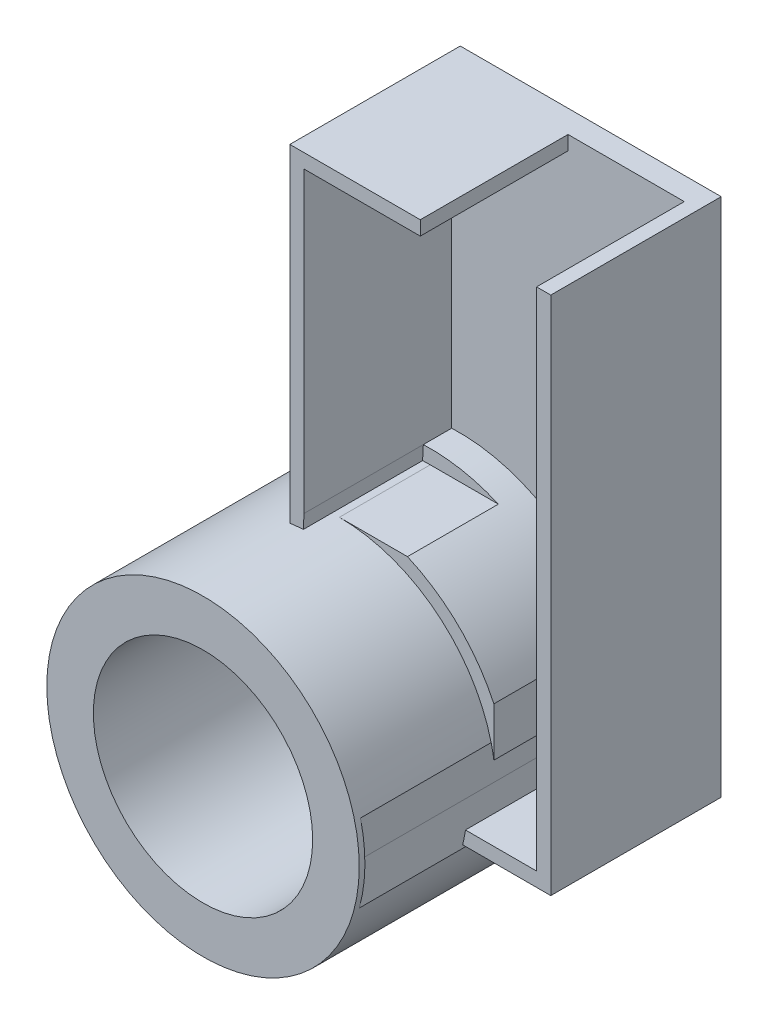
ISO-10303-21;
HEADER;
FILE_DESCRIPTION(('STEP AP214'),'2;1');
FILE_NAME('part.step','',(''),(''),'','','');
FILE_SCHEMA(('AUTOMOTIVE_DESIGN { 1 0 10303 214 1 1 1 1 }'));
ENDSEC;
DATA;
#1=APPLICATION_CONTEXT('core data for automotive mechanical design processes');
#2=APPLICATION_PROTOCOL_DEFINITION('international standard','automotive_design',2000,#1);
#3=PRODUCT_CONTEXT('',#1,'mechanical');
#4=PRODUCT('Part','Part','',(#3));
#5=PRODUCT_RELATED_PRODUCT_CATEGORY('part','',(#4));
#6=PRODUCT_DEFINITION_FORMATION('','',#4);
#7=PRODUCT_DEFINITION_CONTEXT('part definition',#1,'design');
#8=PRODUCT_DEFINITION('design','',#6,#7);
#9=PRODUCT_DEFINITION_SHAPE('','',#8);
#10=(LENGTH_UNIT() NAMED_UNIT(*) SI_UNIT(.MILLI.,.METRE.));
#11=(NAMED_UNIT(*) PLANE_ANGLE_UNIT() SI_UNIT($,.RADIAN.));
#12=(NAMED_UNIT(*) SI_UNIT($,.STERADIAN.) SOLID_ANGLE_UNIT());
#13=UNCERTAINTY_MEASURE_WITH_UNIT(LENGTH_MEASURE(1.E-05),#10,'distance_accuracy_value','');
#14=(GEOMETRIC_REPRESENTATION_CONTEXT(3) GLOBAL_UNCERTAINTY_ASSIGNED_CONTEXT((#13)) GLOBAL_UNIT_ASSIGNED_CONTEXT((#10,
#11,#12)) REPRESENTATION_CONTEXT('',''));
#15=CARTESIAN_POINT('',(0.,0.,0.));
#16=DIRECTION('',(0.,0.,1.));
#17=DIRECTION('',(1.,0.,0.));
#18=AXIS2_PLACEMENT_3D('',#15,#16,#17);
#19=CARTESIAN_POINT('',(28.235445078776,-0.900390084330371,92.));
#20=DIRECTION('',(0.999491944603137,-0.0318724437945979,0.));
#21=DIRECTION('',(0.0318724437945979,0.999491944603137,0.));
#22=AXIS2_PLACEMENT_3D('',#19,#20,#21);
#23=PLANE('',#22);
#24=DIRECTION('',(0.,0.,-1.));
#25=VECTOR('',#24,1.);
#26=CARTESIAN_POINT('',(26.7179309405717,-48.4883054237133,92.));
#27=LINE('',#26,#25);
#28=CARTESIAN_POINT('',(26.7179309405717,-48.4883054237133,69.));
#29=VERTEX_POINT('',#28);
#30=CARTESIAN_POINT('',(26.7179309405717,-48.4883054237133,47.));
#31=VERTEX_POINT('',#30);
#32=EDGE_CURVE('E277',#29,#31,#27,.T.);
#33=ORIENTED_EDGE('',*,*,#32,.F.);
#34=CARTESIAN_POINT('',(26.7179309405717,-48.4883054237133,92.));
#35=VERTEX_POINT('',#34);
#36=EDGE_CURVE('E271',#35,#29,#27,.T.);
#37=ORIENTED_EDGE('',*,*,#36,.F.);
#38=DIRECTION('',(0.0318724437945979,0.999491944603137,0.));
#39=VECTOR('',#38,1.);
#40=CARTESIAN_POINT('',(28.235445078776,-0.900390084330371,92.));
#41=LINE('',#40,#39);
#42=CARTESIAN_POINT('',(26.5102818239271,-55.,92.));
#43=VERTEX_POINT('',#42);
#44=EDGE_CURVE('E396',#43,#35,#41,.T.);
#45=ORIENTED_EDGE('',*,*,#44,.F.);
#46=DIRECTION('',(0.,0.,-1.));
#47=VECTOR('',#46,1.);
#48=CARTESIAN_POINT('',(26.5102818239271,-55.,92.));
#49=LINE('',#48,#47);
#50=CARTESIAN_POINT('',(26.5102818239271,-55.,47.));
#51=VERTEX_POINT('',#50);
#52=EDGE_CURVE('E280',#43,#51,#49,.T.);
#53=ORIENTED_EDGE('',*,*,#52,.T.);
#54=DIRECTION('',(-0.0318724437945979,-0.999491944603137,0.));
#55=VECTOR('',#54,1.);
#56=CARTESIAN_POINT('',(28.235445078776,-0.900390084330371,47.));
#57=LINE('',#56,#55);
#58=EDGE_CURVE('E412',#31,#51,#57,.T.);
#59=ORIENTED_EDGE('',*,*,#58,.F.);
#60=EDGE_LOOP('',(#33,#37,#45,#53,#59));
#61=FACE_BOUND('',#60,.T.);
#62=ADVANCED_FACE('F77',(#61),#23,.T.);
#63=CARTESIAN_POINT('',(26.5102818239271,0.,92.));
#64=DIRECTION('',(-1.,0.,0.));
#65=DIRECTION('',(0.,0.,-1.));
#66=AXIS2_PLACEMENT_3D('',#63,#64,#65);
#67=PLANE('',#66);
#68=DIRECTION('',(0.,1.,0.));
#69=VECTOR('',#68,1.);
#70=CARTESIAN_POINT('',(26.5102818239271,0.,47.));
#71=LINE('',#70,#69);
#72=CARTESIAN_POINT('',(26.5102818239271,-62.3112897368359,47.));
#73=VERTEX_POINT('',#72);
#74=EDGE_CURVE('E92',#73,#51,#71,.T.);
#75=ORIENTED_EDGE('',*,*,#74,.T.);
#76=ORIENTED_EDGE('',*,*,#52,.F.);
#77=DIRECTION('',(0.,-1.,0.));
#78=VECTOR('',#77,1.);
#79=CARTESIAN_POINT('',(26.5102818239271,0.,92.));
#80=LINE('',#79,#78);
#81=CARTESIAN_POINT('',(26.5102818239271,-62.3112897368359,92.));
#82=VERTEX_POINT('',#81);
#83=EDGE_CURVE('E401',#43,#82,#80,.T.);
#84=ORIENTED_EDGE('',*,*,#83,.T.);
#85=DIRECTION('',(0.,0.,-1.));
#86=VECTOR('',#85,1.);
#87=CARTESIAN_POINT('',(26.5102818239271,-62.3112897368359,92.));
#88=LINE('',#87,#86);
#89=EDGE_CURVE('E405',#82,#73,#88,.T.);
#90=ORIENTED_EDGE('',*,*,#89,.T.);
#91=EDGE_LOOP('',(#75,#76,#84,#90));
#92=FACE_BOUND('',#91,.T.);
#93=ADVANCED_FACE('F414',(#92),#67,.F.);
#94=CARTESIAN_POINT('',(0.,-81.9229318060306,92.));
#95=DIRECTION('',(0.,-1.,0.));
#96=DIRECTION('',(0.,0.,1.));
#97=AXIS2_PLACEMENT_3D('',#94,#95,#96);
#98=PLANE('',#97);
#99=DIRECTION('',(0.,0.,-1.));
#100=VECTOR('',#99,1.);
#101=CARTESIAN_POINT('',(5.60408270529834,-81.9229318060306,92.));
#102=LINE('',#101,#100);
#103=CARTESIAN_POINT('',(5.60408270529834,-81.9229318060306,92.));
#104=VERTEX_POINT('',#103);
#105=CARTESIAN_POINT('',(5.60408270529834,-81.9229318060306,47.));
#106=VERTEX_POINT('',#105);
#107=EDGE_CURVE('E393',#104,#106,#102,.T.);
#108=ORIENTED_EDGE('',*,*,#107,.F.);
#109=DIRECTION('',(1.,0.,0.));
#110=VECTOR('',#109,1.);
#111=CARTESIAN_POINT('',(0.,-81.9229318060306,92.));
#112=LINE('',#111,#110);
#113=CARTESIAN_POINT('',(-5.60408270529832,-81.9229318060306,92.));
#114=VERTEX_POINT('',#113);
#115=EDGE_CURVE('E381',#114,#104,#112,.T.);
#116=ORIENTED_EDGE('',*,*,#115,.F.);
#117=DIRECTION('',(0.,0.,-1.));
#118=VECTOR('',#117,1.);
#119=CARTESIAN_POINT('',(-5.60408270529832,-81.9229318060306,92.));
#120=LINE('',#119,#118);
#121=CARTESIAN_POINT('',(-5.60408270529832,-81.9229318060306,47.));
#122=VERTEX_POINT('',#121);
#123=EDGE_CURVE('E392',#114,#122,#120,.T.);
#124=ORIENTED_EDGE('',*,*,#123,.T.);
#125=DIRECTION('',(-1.,0.,0.));
#126=VECTOR('',#125,1.);
#127=CARTESIAN_POINT('',(0.,-81.9229318060306,47.));
#128=LINE('',#127,#126);
#129=EDGE_CURVE('E505',#106,#122,#128,.T.);
#130=ORIENTED_EDGE('',*,*,#129,.F.);
#131=EDGE_LOOP('',(#108,#116,#124,#130));
#132=FACE_BOUND('',#131,.T.);
#133=ADVANCED_FACE('F550',(#132),#98,.T.);
#134=CARTESIAN_POINT('',(0.,-55.,48.));
#135=DIRECTION('',(0.,0.,-1.));
#136=DIRECTION('',(1.,0.,0.));
#137=AXIS2_PLACEMENT_3D('',#134,#135,#136);
#138=CYLINDRICAL_SURFACE('',#137,27.5);
#139=CARTESIAN_POINT('',(0.,-55.,47.));
#140=DIRECTION('',(0.,0.,1.));
#141=DIRECTION('',(1.,0.,0.));
#142=AXIS2_PLACEMENT_3D('',#139,#140,#141);
#143=CIRCLE('',#142,27.5);
#144=CARTESIAN_POINT('',(26.7042036884893,-61.5677625842956,47.));
#145=VERTEX_POINT('',#144);
#146=EDGE_CURVE('E419',#145,#31,#143,.T.);
#147=ORIENTED_EDGE('',*,*,#146,.F.);
#148=DIRECTION('',(0.,0.,-1.));
#149=VECTOR('',#148,1.);
#150=CARTESIAN_POINT('',(26.7042036884893,-61.5677625842956,48.));
#151=LINE('',#150,#149);
#152=CARTESIAN_POINT('',(26.7042036884893,-61.5677625842956,74.));
#153=VERTEX_POINT('',#152);
#154=EDGE_CURVE('E261',#153,#145,#151,.T.);
#155=ORIENTED_EDGE('',*,*,#154,.F.);
#156=CARTESIAN_POINT('',(9.26342336171615E-13,-54.9999999999992,74.));
#157=DIRECTION('',(0.,0.,1.));
#158=DIRECTION('',(-1.,0.,0.));
#159=AXIS2_PLACEMENT_3D('',#156,#157,#158);
#160=CIRCLE('',#159,27.4999999999993);
#161=CARTESIAN_POINT('',(27.19748715521,-59.0677625842956,74.));
#162=VERTEX_POINT('',#161);
#163=EDGE_CURVE('E362',#153,#162,#160,.T.);
#164=ORIENTED_EDGE('',*,*,#163,.T.);
#165=DIRECTION('',(0.,0.,1.));
#166=VECTOR('',#165,1.);
#167=CARTESIAN_POINT('',(27.19748715521,-59.0677625842956,53.));
#168=LINE('',#167,#166);
#169=CARTESIAN_POINT('',(27.19748715521,-59.0677625842956,53.));
#170=VERTEX_POINT('',#169);
#171=EDGE_CURVE('E320',#170,#162,#168,.T.);
#172=ORIENTED_EDGE('',*,*,#171,.F.);
#173=CARTESIAN_POINT('',(0.,-55.,53.));
#174=DIRECTION('',(0.,0.,1.));
#175=DIRECTION('',(1.,0.,0.));
#176=AXIS2_PLACEMENT_3D('',#173,#174,#175);
#177=CIRCLE('',#176,27.5000000000001);
#178=CARTESIAN_POINT('',(27.19748715521,-50.9322374157041,53.));
#179=VERTEX_POINT('',#178);
#180=EDGE_CURVE('E301',#170,#179,#177,.T.);
#181=ORIENTED_EDGE('',*,*,#180,.T.);
#182=DIRECTION('',(0.,0.,-1.));
#183=VECTOR('',#182,1.);
#184=CARTESIAN_POINT('',(27.19748715521,-50.9322374157041,69.));
#185=LINE('',#184,#183);
#186=CARTESIAN_POINT('',(27.19748715521,-50.9322374157041,69.));
#187=VERTEX_POINT('',#186);
#188=EDGE_CURVE('E309',#187,#179,#185,.T.);
#189=ORIENTED_EDGE('',*,*,#188,.F.);
#190=CARTESIAN_POINT('',(1.02890786168874E-13,-55.,69.));
#191=DIRECTION('',(0.,0.,-1.));
#192=DIRECTION('',(-1.,0.,0.));
#193=AXIS2_PLACEMENT_3D('',#190,#191,#192);
#194=CIRCLE('',#193,27.5);
#195=EDGE_CURVE('E420',#29,#187,#194,.T.);
#196=ORIENTED_EDGE('',*,*,#195,.F.);
#197=ORIENTED_EDGE('',*,*,#32,.T.);
#198=EDGE_LOOP('',(#147,#155,#164,#172,#181,#189,#196,#197));
#199=FACE_BOUND('',#198,.T.);
#200=ADVANCED_FACE('F317',(#199),#138,.F.);
#201=CARTESIAN_POINT('',(9.26342336171615E-13,-54.9999999999992,74.));
#202=DIRECTION('',(0.,0.,-1.));
#203=DIRECTION('',(1.,0.,0.));
#204=AXIS2_PLACEMENT_3D('',#201,#202,#203);
#205=PLANE('',#204);
#206=DIRECTION('',(0.,-1.,0.));
#207=VECTOR('',#206,1.);
#208=CARTESIAN_POINT('',(39.7172468413498,29.9886968621763,74.));
#209=LINE('',#208,#207);
#210=CARTESIAN_POINT('',(39.7172468413498,29.9886968621763,74.));
#211=VERTEX_POINT('',#210);
#212=CARTESIAN_POINT('',(39.7172468413498,-59.0677625842956,74.));
#213=VERTEX_POINT('',#212);
#214=EDGE_CURVE('E344',#211,#213,#209,.T.);
#215=ORIENTED_EDGE('',*,*,#214,.T.);
#216=DIRECTION('',(-1.,0.,0.));
#217=VECTOR('',#216,1.);
#218=CARTESIAN_POINT('',(26.7042036884893,-59.0677625842956,74.));
#219=LINE('',#218,#217);
#220=EDGE_CURVE('E347',#213,#162,#219,.T.);
#221=ORIENTED_EDGE('',*,*,#220,.T.);
#222=ORIENTED_EDGE('',*,*,#163,.F.);
#223=DIRECTION('',(-1.,0.,0.));
#224=VECTOR('',#223,1.);
#225=CARTESIAN_POINT('',(26.7042036884893,-61.5677625842956,74.));
#226=LINE('',#225,#224);
#227=CARTESIAN_POINT('',(42.2172468413498,-61.5677625842956,74.));
#228=VERTEX_POINT('',#227);
#229=EDGE_CURVE('E255',#228,#153,#226,.T.);
#230=ORIENTED_EDGE('',*,*,#229,.F.);
#231=DIRECTION('',(0.,-1.,0.));
#232=VECTOR('',#231,1.);
#233=CARTESIAN_POINT('',(42.2172468413498,29.9886968621763,74.));
#234=LINE('',#233,#232);
#235=CARTESIAN_POINT('',(42.2172468413498,29.9886968621763,74.));
#236=VERTEX_POINT('',#235);
#237=EDGE_CURVE('E371',#236,#228,#234,.T.);
#238=ORIENTED_EDGE('',*,*,#237,.F.);
#239=DIRECTION('',(1.,0.,0.));
#240=VECTOR('',#239,1.);
#241=CARTESIAN_POINT('',(42.2172468413498,29.9886968621763,74.));
#242=LINE('',#241,#240);
#243=EDGE_CURVE('E367',#211,#236,#242,.T.);
#244=ORIENTED_EDGE('',*,*,#243,.F.);
#245=EDGE_LOOP('',(#215,#221,#222,#230,#238,#244));
#246=FACE_BOUND('',#245,.T.);
#247=ADVANCED_FACE('F478',(#246),#205,.F.);
#248=CARTESIAN_POINT('',(0.,-55.,53.));
#249=DIRECTION('',(0.,0.,1.));
#250=DIRECTION('',(-1.,0.,0.));
#251=AXIS2_PLACEMENT_3D('',#248,#249,#250);
#252=PLANE('',#251);
#253=CARTESIAN_POINT('',(0.,-55.,53.));
#254=DIRECTION('',(0.,0.,-1.));
#255=DIRECTION('',(-1.,0.,0.));
#256=AXIS2_PLACEMENT_3D('',#253,#254,#255);
#257=CIRCLE('',#256,30.0000000000001);
#258=CARTESIAN_POINT('',(-1.21934232207703,-25.0247901708496,53.));
#259=VERTEX_POINT('',#258);
#260=CARTESIAN_POINT('',(11.9895788082825,-27.5000000000002,53.));
#261=VERTEX_POINT('',#260);
#262=EDGE_CURVE('E439',#259,#261,#257,.T.);
#263=ORIENTED_EDGE('',*,*,#262,.F.);
#264=DIRECTION('',(0.0515044310788241,0.998672766014597,0.));
#265=VECTOR('',#264,1.);
#266=CARTESIAN_POINT('',(-1.34870270419509,-27.5330926201055,53.));
#267=LINE('',#266,#265);
#268=CARTESIAN_POINT('',(-1.34870270419509,-27.5330926201055,53.));
#269=VERTEX_POINT('',#268);
#270=EDGE_CURVE('E321',#269,#259,#267,.T.);
#271=ORIENTED_EDGE('',*,*,#270,.F.);
#272=CARTESIAN_POINT('',(0.,-27.4999999999999,53.));
#273=VERTEX_POINT('',#272);
#274=EDGE_CURVE('E322',#273,#269,#177,.T.);
#275=ORIENTED_EDGE('',*,*,#274,.F.);
#276=DIRECTION('',(-1.,0.,0.));
#277=VECTOR('',#276,1.);
#278=CARTESIAN_POINT('',(0.,-27.4999999999999,53.));
#279=LINE('',#278,#277);
#280=EDGE_CURVE('E12',#261,#273,#279,.T.);
#281=ORIENTED_EDGE('',*,*,#280,.F.);
#282=EDGE_LOOP('',(#263,#271,#275,#281));
#283=FACE_BOUND('',#282,.T.);
#284=ADVANCED_FACE('F456',(#283),#252,.T.);
#285=CARTESIAN_POINT('',(9.26342336171615E-13,-54.9999999999992,74.));
#286=DIRECTION('',(0.,0.,-1.));
#287=DIRECTION('',(1.,0.,0.));
#288=AXIS2_PLACEMENT_3D('',#285,#286,#287);
#289=CYLINDRICAL_SURFACE('',#288,29.9999999999993);
#290=CARTESIAN_POINT('',(27.19748715521,-42.3391669925634,53.));
#291=VERTEX_POINT('',#290);
#292=CARTESIAN_POINT('',(29.722942444479,-59.0677625842956,53.));
#293=VERTEX_POINT('',#292);
#294=EDGE_CURVE('E304',#291,#293,#257,.T.);
#295=ORIENTED_EDGE('',*,*,#294,.T.);
#296=DIRECTION('',(0.,0.,-1.));
#297=VECTOR('',#296,1.);
#298=CARTESIAN_POINT('',(29.722942444479,-59.0677625842956,74.));
#299=LINE('',#298,#297);
#300=CARTESIAN_POINT('',(29.722942444479,-59.0677625842956,48.));
#301=VERTEX_POINT('',#300);
#302=EDGE_CURVE('E349',#293,#301,#299,.T.);
#303=ORIENTED_EDGE('',*,*,#302,.T.);
#304=CARTESIAN_POINT('',(9.26342336171615E-13,-54.9999999999992,48.));
#305=DIRECTION('',(0.,0.,1.));
#306=DIRECTION('',(1.,0.,0.));
#307=AXIS2_PLACEMENT_3D('',#304,#305,#306);
#308=CIRCLE('',#307,29.9999999999993);
#309=CARTESIAN_POINT('',(-1.21934232207703,-25.0247901708496,48.));
#310=VERTEX_POINT('',#309);
#311=EDGE_CURVE('E293',#301,#310,#308,.T.);
#312=ORIENTED_EDGE('',*,*,#311,.T.);
#313=DIRECTION('',(0.,0.,-1.));
#314=VECTOR('',#313,1.);
#315=CARTESIAN_POINT('',(-1.21934232207703,-25.0247901708496,74.));
#316=LINE('',#315,#314);
#317=EDGE_CURVE('E358',#259,#310,#316,.T.);
#318=ORIENTED_EDGE('',*,*,#317,.F.);
#319=ORIENTED_EDGE('',*,*,#262,.T.);
#320=DIRECTION('',(0.,0.,-1.));
#321=VECTOR('',#320,1.);
#322=CARTESIAN_POINT('',(11.9895788082827,-27.4999999999999,69.));
#323=LINE('',#322,#321);
#324=CARTESIAN_POINT('',(11.9895788082827,-27.4999999999999,69.));
#325=VERTEX_POINT('',#324);
#326=EDGE_CURVE('E437',#325,#261,#323,.T.);
#327=ORIENTED_EDGE('',*,*,#326,.F.);
#328=CARTESIAN_POINT('',(9.26342336171615E-13,-54.9999999999992,69.));
#329=DIRECTION('',(0.,0.,-1.));
#330=DIRECTION('',(-1.,0.,0.));
#331=AXIS2_PLACEMENT_3D('',#328,#329,#330);
#332=CIRCLE('',#331,29.9999999999993);
#333=CARTESIAN_POINT('',(27.19748715521,-42.3391669925625,69.));
#334=VERTEX_POINT('',#333);
#335=EDGE_CURVE('E432',#334,#325,#332,.F.);
#336=ORIENTED_EDGE('',*,*,#335,.F.);
#337=DIRECTION('',(0.,0.,-1.));
#338=VECTOR('',#337,1.);
#339=CARTESIAN_POINT('',(27.19748715521,-42.3391669925625,69.));
#340=LINE('',#339,#338);
#341=EDGE_CURVE('E315',#334,#291,#340,.T.);
#342=ORIENTED_EDGE('',*,*,#341,.T.);
#343=EDGE_LOOP('',(#295,#303,#312,#318,#319,#327,#336,#342));
#344=FACE_BOUND('',#343,.T.);
#345=ADVANCED_FACE('F445',(#344),#289,.T.);
#346=CARTESIAN_POINT('',(0.,-55.,44.));
#347=DIRECTION('',(0.,0.,1.));
#348=DIRECTION('',(-1.,0.,0.));
#349=AXIS2_PLACEMENT_3D('',#346,#347,#348);
#350=CYLINDRICAL_SURFACE('',#349,27.5);
#351=ORIENTED_EDGE('',*,*,#123,.F.);
#352=CARTESIAN_POINT('',(0.,-55.,92.));
#353=DIRECTION('',(0.,0.,1.));
#354=DIRECTION('',(1.,0.,0.));
#355=AXIS2_PLACEMENT_3D('',#352,#353,#354);
#356=CIRCLE('',#355,27.5);
#357=EDGE_CURVE('E390',#114,#104,#356,.T.);
#358=ORIENTED_EDGE('',*,*,#357,.T.);
#359=ORIENTED_EDGE('',*,*,#107,.T.);
#360=EDGE_CURVE('E508',#122,#106,#143,.T.);
#361=ORIENTED_EDGE('',*,*,#360,.F.);
#362=EDGE_LOOP('',(#351,#358,#359,#361));
#363=FACE_BOUND('',#362,.T.);
#364=CARTESIAN_POINT('',(0.,-55.,44.));
#365=DIRECTION('',(0.,0.,1.));
#366=DIRECTION('',(1.,0.,0.));
#367=AXIS2_PLACEMENT_3D('',#364,#365,#366);
#368=CIRCLE('',#367,27.5);
#369=CARTESIAN_POINT('',(-3.71934232207703,-27.7526791648939,44.));
#370=VERTEX_POINT('',#369);
#371=CARTESIAN_POINT('',(26.7042036884893,-61.5677625842956,44.));
#372=VERTEX_POINT('',#371);
#373=EDGE_CURVE('E250',#370,#372,#368,.T.);
#374=ORIENTED_EDGE('',*,*,#373,.T.);
#375=EDGE_CURVE('E258',#145,#372,#151,.T.);
#376=ORIENTED_EDGE('',*,*,#375,.F.);
#377=EDGE_CURVE('E100',#73,#145,#143,.T.);
#378=ORIENTED_EDGE('',*,*,#377,.F.);
#379=ORIENTED_EDGE('',*,*,#89,.F.);
#380=CARTESIAN_POINT('',(0.,-55.,92.));
#381=DIRECTION('',(0.,0.,1.));
#382=DIRECTION('',(1.,0.,0.));
#383=AXIS2_PLACEMENT_3D('',#380,#381,#382);
#384=CIRCLE('',#383,27.5);
#385=EDGE_CURVE('E404',#82,#35,#384,.T.);
#386=ORIENTED_EDGE('',*,*,#385,.T.);
#387=ORIENTED_EDGE('',*,*,#36,.T.);
#388=CARTESIAN_POINT('',(1.02751297047818E-13,-27.5,69.));
#389=VERTEX_POINT('',#388);
#390=EDGE_CURVE('E418',#389,#29,#194,.T.);
#391=ORIENTED_EDGE('',*,*,#390,.F.);
#392=DIRECTION('',(0.,0.,-1.));
#393=VECTOR('',#392,1.);
#394=CARTESIAN_POINT('',(1.02751297047818E-13,-27.4999999999999,69.));
#395=LINE('',#394,#393);
#396=EDGE_CURVE('E333',#389,#273,#395,.T.);
#397=ORIENTED_EDGE('',*,*,#396,.T.);
#398=ORIENTED_EDGE('',*,*,#274,.T.);
#399=DIRECTION('',(0.,0.,1.));
#400=VECTOR('',#399,1.);
#401=CARTESIAN_POINT('',(-1.34870270419509,-27.5330926201055,53.));
#402=LINE('',#401,#400);
#403=CARTESIAN_POINT('',(-1.34870270419509,-27.5330926201055,74.));
#404=VERTEX_POINT('',#403);
#405=EDGE_CURVE('E334',#269,#404,#402,.T.);
#406=ORIENTED_EDGE('',*,*,#405,.T.);
#407=CARTESIAN_POINT('',(-3.71934232207703,-27.7526791648939,74.));
#408=VERTEX_POINT('',#407);
#409=EDGE_CURVE('E361',#404,#408,#160,.T.);
#410=ORIENTED_EDGE('',*,*,#409,.T.);
#411=DIRECTION('',(0.,0.,-1.));
#412=VECTOR('',#411,1.);
#413=CARTESIAN_POINT('',(-3.71934232207703,-27.7526791648939,48.));
#414=LINE('',#413,#412);
#415=EDGE_CURVE('E269',#408,#370,#414,.T.);
#416=ORIENTED_EDGE('',*,*,#415,.T.);
#417=EDGE_LOOP('',(#374,#376,#378,#379,#386,#387,#391,#397,#398,#406,#410,#416));
#418=FACE_BOUND('',#417,.T.);
#419=CARTESIAN_POINT('',(0.,-55.,93.));
#420=DIRECTION('',(0.,0.,-1.));
#421=DIRECTION('',(-1.,0.,0.));
#422=AXIS2_PLACEMENT_3D('',#419,#420,#421);
#423=CIRCLE('',#422,27.5);
#424=CARTESIAN_POINT('',(-27.5,-55.,93.));
#425=VERTEX_POINT('',#424);
#426=EDGE_CURVE('E270',#425,#425,#423,.T.);
#427=ORIENTED_EDGE('',*,*,#426,.T.);
#428=EDGE_LOOP('',(#427));
#429=FACE_BOUND('',#428,.T.);
#430=ADVANCED_FACE('F79',(#363,#418,#429),#350,.T.);
#431=CARTESIAN_POINT('',(0.,-55.,44.));
#432=DIRECTION('',(0.,0.,-1.));
#433=DIRECTION('',(1.,0.,0.));
#434=AXIS2_PLACEMENT_3D('',#431,#432,#433);
#435=PLANE('',#434);
#436=DIRECTION('',(0.,-1.,0.));
#437=VECTOR('',#436,1.);
#438=CARTESIAN_POINT('',(-3.71934232207703,0.,44.));
#439=LINE('',#438,#437);
#440=CARTESIAN_POINT('',(-3.71934232207703,29.9886968621763,44.));
#441=VERTEX_POINT('',#440);
#442=EDGE_CURVE('E263',#441,#370,#439,.T.);
#443=ORIENTED_EDGE('',*,*,#442,.F.);
#444=DIRECTION('',(-1.,0.,0.));
#445=VECTOR('',#444,1.);
#446=CARTESIAN_POINT('',(0.,29.9886968621763,44.));
#447=LINE('',#446,#445);
#448=CARTESIAN_POINT('',(42.2172468413498,29.9886968621763,44.));
#449=VERTEX_POINT('',#448);
#450=EDGE_CURVE('E376',#449,#441,#447,.T.);
#451=ORIENTED_EDGE('',*,*,#450,.F.);
#452=DIRECTION('',(0.,1.,0.));
#453=VECTOR('',#452,1.);
#454=CARTESIAN_POINT('',(42.2172468413498,0.,44.));
#455=LINE('',#454,#453);
#456=CARTESIAN_POINT('',(42.2172468413498,-61.5677625842956,44.));
#457=VERTEX_POINT('',#456);
#458=EDGE_CURVE('E253',#457,#449,#455,.T.);
#459=ORIENTED_EDGE('',*,*,#458,.F.);
#460=DIRECTION('',(1.,0.,0.));
#461=VECTOR('',#460,1.);
#462=CARTESIAN_POINT('',(0.,-61.5677625842956,44.));
#463=LINE('',#462,#461);
#464=EDGE_CURVE('E244',#372,#457,#463,.T.);
#465=ORIENTED_EDGE('',*,*,#464,.F.);
#466=ORIENTED_EDGE('',*,*,#373,.F.);
#467=EDGE_LOOP('',(#443,#451,#459,#465,#466));
#468=FACE_BOUND('',#467,.T.);
#469=CARTESIAN_POINT('',(0.,-55.,44.));
#470=DIRECTION('',(0.,0.,1.));
#471=DIRECTION('',(1.,0.,0.));
#472=AXIS2_PLACEMENT_3D('',#469,#470,#471);
#473=CIRCLE('',#472,7.25);
#474=CARTESIAN_POINT('',(7.25000000000001,-55.,44.));
#475=VERTEX_POINT('',#474);
#476=EDGE_CURVE('E511',#475,#475,#473,.T.);
#477=ORIENTED_EDGE('',*,*,#476,.T.);
#478=EDGE_LOOP('',(#477));
#479=FACE_BOUND('',#478,.T.);
#480=ADVANCED_FACE('F247',(#468,#479),#435,.T.);
#481=CARTESIAN_POINT('',(0.,-55.,93.));
#482=DIRECTION('',(0.,0.,1.));
#483=DIRECTION('',(-1.,0.,0.));
#484=AXIS2_PLACEMENT_3D('',#481,#482,#483);
#485=PLANE('',#484);
#486=CARTESIAN_POINT('',(0.,-55.,93.));
#487=DIRECTION('',(0.,0.,1.));
#488=DIRECTION('',(1.,0.,0.));
#489=AXIS2_PLACEMENT_3D('',#486,#487,#488);
#490=CIRCLE('',#489,19.3);
#491=CARTESIAN_POINT('',(19.3,-55.,93.));
#492=VERTEX_POINT('',#491);
#493=EDGE_CURVE('E517',#492,#492,#490,.T.);
#494=ORIENTED_EDGE('',*,*,#493,.F.);
#495=EDGE_LOOP('',(#494));
#496=FACE_BOUND('',#495,.T.);
#497=ORIENTED_EDGE('',*,*,#426,.F.);
#498=EDGE_LOOP('',(#497));
#499=FACE_BOUND('',#498,.T.);
#500=ADVANCED_FACE('F532',(#496,#499),#485,.T.);
#501=CARTESIAN_POINT('',(0.,0.,92.));
#502=DIRECTION('',(0.,0.,-1.));
#503=DIRECTION('',(1.,0.,0.));
#504=AXIS2_PLACEMENT_3D('',#501,#502,#503);
#505=PLANE('',#504);
#506=ORIENTED_EDGE('',*,*,#44,.T.);
#507=ORIENTED_EDGE('',*,*,#385,.F.);
#508=ORIENTED_EDGE('',*,*,#83,.F.);
#509=EDGE_LOOP('',(#506,#507,#508));
#510=FACE_BOUND('',#509,.T.);
#511=ADVANCED_FACE('F416',(#510),#505,.T.);
#512=CARTESIAN_POINT('',(0.,0.,92.));
#513=DIRECTION('',(0.,0.,-1.));
#514=DIRECTION('',(1.,0.,0.));
#515=AXIS2_PLACEMENT_3D('',#512,#513,#514);
#516=PLANE('',#515);
#517=ORIENTED_EDGE('',*,*,#115,.T.);
#518=ORIENTED_EDGE('',*,*,#357,.F.);
#519=EDGE_LOOP('',(#517,#518));
#520=FACE_BOUND('',#519,.T.);
#521=ADVANCED_FACE('F555',(#520),#516,.T.);
#522=CARTESIAN_POINT('',(-3.71934232207703,0.,48.));
#523=DIRECTION('',(-1.,0.,0.));
#524=DIRECTION('',(0.,0.,-1.));
#525=AXIS2_PLACEMENT_3D('',#522,#523,#524);
#526=PLANE('',#525);
#527=ORIENTED_EDGE('',*,*,#442,.T.);
#528=ORIENTED_EDGE('',*,*,#415,.F.);
#529=DIRECTION('',(0.,1.,0.));
#530=VECTOR('',#529,1.);
#531=CARTESIAN_POINT('',(-3.71934232207703,29.9886968621763,74.));
#532=LINE('',#531,#530);
#533=CARTESIAN_POINT('',(-3.71934232207703,29.9886968621763,74.));
#534=VERTEX_POINT('',#533);
#535=EDGE_CURVE('E364',#408,#534,#532,.T.);
#536=ORIENTED_EDGE('',*,*,#535,.T.);
#537=DIRECTION('',(0.,0.,-1.));
#538=VECTOR('',#537,1.);
#539=CARTESIAN_POINT('',(-3.71934232207703,29.9886968621763,48.));
#540=LINE('',#539,#538);
#541=EDGE_CURVE('E382',#534,#441,#540,.T.);
#542=ORIENTED_EDGE('',*,*,#541,.T.);
#543=EDGE_LOOP('',(#527,#528,#536,#542));
#544=FACE_BOUND('',#543,.T.);
#545=ADVANCED_FACE('F466',(#544),#526,.T.);
#546=CARTESIAN_POINT('',(0.,29.9886968621763,48.));
#547=DIRECTION('',(0.,1.,0.));
#548=DIRECTION('',(0.,0.,-1.));
#549=AXIS2_PLACEMENT_3D('',#546,#547,#548);
#550=PLANE('',#549);
#551=DIRECTION('',(1.,0.,0.));
#552=VECTOR('',#551,1.);
#553=CARTESIAN_POINT('',(19.2489522596364,29.9886968621763,48.));
#554=LINE('',#553,#552);
#555=CARTESIAN_POINT('',(19.2489522596364,29.9886968621763,48.));
#556=VERTEX_POINT('',#555);
#557=CARTESIAN_POINT('',(39.7172468413498,29.9886968621763,48.));
#558=VERTEX_POINT('',#557);
#559=EDGE_CURVE('E497',#556,#558,#554,.T.);
#560=ORIENTED_EDGE('',*,*,#559,.T.);
#561=DIRECTION('',(0.,0.,1.));
#562=VECTOR('',#561,1.);
#563=CARTESIAN_POINT('',(39.7172468413498,29.9886968621763,53.));
#564=LINE('',#563,#562);
#565=EDGE_CURVE('E422',#558,#211,#564,.T.);
#566=ORIENTED_EDGE('',*,*,#565,.T.);
#567=ORIENTED_EDGE('',*,*,#243,.T.);
#568=DIRECTION('',(0.,0.,-1.));
#569=VECTOR('',#568,1.);
#570=CARTESIAN_POINT('',(42.2172468413498,29.9886968621763,48.));
#571=LINE('',#570,#569);
#572=EDGE_CURVE('E384',#236,#449,#571,.T.);
#573=ORIENTED_EDGE('',*,*,#572,.T.);
#574=ORIENTED_EDGE('',*,*,#450,.T.);
#575=ORIENTED_EDGE('',*,*,#541,.F.);
#576=CARTESIAN_POINT('',(19.2489522596364,29.9886968621763,74.));
#577=VERTEX_POINT('',#576);
#578=EDGE_CURVE('E368',#534,#577,#242,.T.);
#579=ORIENTED_EDGE('',*,*,#578,.T.);
#580=DIRECTION('',(0.,0.,1.));
#581=VECTOR('',#580,1.);
#582=CARTESIAN_POINT('',(19.2489522596364,29.9886968621763,53.));
#583=LINE('',#582,#581);
#584=EDGE_CURVE('E425',#556,#577,#583,.T.);
#585=ORIENTED_EDGE('',*,*,#584,.F.);
#586=EDGE_LOOP('',(#560,#566,#567,#573,#574,#575,#579,#585));
#587=FACE_BOUND('',#586,.T.);
#588=ADVANCED_FACE('F469',(#587),#550,.T.);
#589=CARTESIAN_POINT('',(42.2172468413498,0.,48.));
#590=DIRECTION('',(1.,0.,0.));
#591=DIRECTION('',(0.,0.,1.));
#592=AXIS2_PLACEMENT_3D('',#589,#590,#591);
#593=PLANE('',#592);
#594=ORIENTED_EDGE('',*,*,#458,.T.);
#595=ORIENTED_EDGE('',*,*,#572,.F.);
#596=ORIENTED_EDGE('',*,*,#237,.T.);
#597=DIRECTION('',(0.,0.,-1.));
#598=VECTOR('',#597,1.);
#599=CARTESIAN_POINT('',(42.2172468413498,-61.5677625842956,48.));
#600=LINE('',#599,#598);
#601=EDGE_CURVE('E386',#228,#457,#600,.T.);
#602=ORIENTED_EDGE('',*,*,#601,.T.);
#603=EDGE_LOOP('',(#594,#595,#596,#602));
#604=FACE_BOUND('',#603,.T.);
#605=ADVANCED_FACE('F474',(#604),#593,.T.);
#606=CARTESIAN_POINT('',(0.,-61.5677625842956,48.));
#607=DIRECTION('',(0.,-1.,0.));
#608=DIRECTION('',(0.,0.,1.));
#609=AXIS2_PLACEMENT_3D('',#606,#607,#608);
#610=PLANE('',#609);
#611=ORIENTED_EDGE('',*,*,#464,.T.);
#612=ORIENTED_EDGE('',*,*,#601,.F.);
#613=ORIENTED_EDGE('',*,*,#229,.T.);
#614=ORIENTED_EDGE('',*,*,#154,.T.);
#615=ORIENTED_EDGE('',*,*,#375,.T.);
#616=EDGE_LOOP('',(#611,#612,#613,#614,#615));
#617=FACE_BOUND('',#616,.T.);
#618=ADVANCED_FACE('F259',(#617),#610,.T.);
#619=CARTESIAN_POINT('',(-1.21934232207703,29.9886968621763,74.));
#620=DIRECTION('',(1.,0.,0.));
#621=DIRECTION('',(0.,0.,1.));
#622=AXIS2_PLACEMENT_3D('',#619,#620,#621);
#623=PLANE('',#622);
#624=DIRECTION('',(0.,1.,0.));
#625=VECTOR('',#624,1.);
#626=CARTESIAN_POINT('',(-1.21934232207703,0.,48.));
#627=LINE('',#626,#625);
#628=CARTESIAN_POINT('',(-1.21934232207703,27.4886968621763,48.));
#629=VERTEX_POINT('',#628);
#630=EDGE_CURVE('E290',#310,#629,#627,.T.);
#631=ORIENTED_EDGE('',*,*,#630,.T.);
#632=DIRECTION('',(0.,0.,-1.));
#633=VECTOR('',#632,1.);
#634=CARTESIAN_POINT('',(-1.21934232207703,27.4886968621763,74.));
#635=LINE('',#634,#633);
#636=CARTESIAN_POINT('',(-1.21934232207703,27.4886968621763,74.));
#637=VERTEX_POINT('',#636);
#638=EDGE_CURVE('E355',#637,#629,#635,.T.);
#639=ORIENTED_EDGE('',*,*,#638,.F.);
#640=DIRECTION('',(0.,1.,0.));
#641=VECTOR('',#640,1.);
#642=CARTESIAN_POINT('',(-1.21934232207703,29.9886968621763,74.));
#643=LINE('',#642,#641);
#644=CARTESIAN_POINT('',(-1.21934232207703,-25.0247901708496,74.));
#645=VERTEX_POINT('',#644);
#646=EDGE_CURVE('E337',#645,#637,#643,.T.);
#647=ORIENTED_EDGE('',*,*,#646,.F.);
#648=EDGE_CURVE('E359',#645,#259,#316,.T.);
#649=ORIENTED_EDGE('',*,*,#648,.T.);
#650=ORIENTED_EDGE('',*,*,#317,.T.);
#651=EDGE_LOOP('',(#631,#639,#647,#649,#650));
#652=FACE_BOUND('',#651,.T.);
#653=ADVANCED_FACE('F488',(#652),#623,.T.);
#654=CARTESIAN_POINT('',(42.2172468413498,27.4886968621763,74.));
#655=DIRECTION('',(0.,-1.,0.));
#656=DIRECTION('',(0.,0.,1.));
#657=AXIS2_PLACEMENT_3D('',#654,#655,#656);
#658=PLANE('',#657);
#659=DIRECTION('',(0.,0.,1.));
#660=VECTOR('',#659,1.);
#661=CARTESIAN_POINT('',(19.2489522596364,27.4886968621763,53.));
#662=LINE('',#661,#660);
#663=CARTESIAN_POINT('',(19.2489522596364,27.4886968621763,48.));
#664=VERTEX_POINT('',#663);
#665=CARTESIAN_POINT('',(19.2489522596364,27.4886968621763,74.));
#666=VERTEX_POINT('',#665);
#667=EDGE_CURVE('E429',#664,#666,#662,.T.);
#668=ORIENTED_EDGE('',*,*,#667,.T.);
#669=DIRECTION('',(1.,0.,0.));
#670=VECTOR('',#669,1.);
#671=CARTESIAN_POINT('',(42.2172468413498,27.4886968621763,74.));
#672=LINE('',#671,#670);
#673=EDGE_CURVE('E341',#637,#666,#672,.T.);
#674=ORIENTED_EDGE('',*,*,#673,.F.);
#675=ORIENTED_EDGE('',*,*,#638,.T.);
#676=DIRECTION('',(1.,0.,0.));
#677=VECTOR('',#676,1.);
#678=CARTESIAN_POINT('',(0.,27.4886968621763,48.));
#679=LINE('',#678,#677);
#680=EDGE_CURVE('E287',#629,#664,#679,.T.);
#681=ORIENTED_EDGE('',*,*,#680,.T.);
#682=EDGE_LOOP('',(#668,#674,#675,#681));
#683=FACE_BOUND('',#682,.T.);
#684=ADVANCED_FACE('F495',(#683),#658,.T.);
#685=CARTESIAN_POINT('',(39.7172468413498,29.9886968621763,74.));
#686=DIRECTION('',(-1.,0.,0.));
#687=DIRECTION('',(0.,0.,-1.));
#688=AXIS2_PLACEMENT_3D('',#685,#686,#687);
#689=PLANE('',#688);
#690=DIRECTION('',(0.,-1.,0.));
#691=VECTOR('',#690,1.);
#692=CARTESIAN_POINT('',(39.7172468413498,0.,48.));
#693=LINE('',#692,#691);
#694=CARTESIAN_POINT('',(39.7172468413498,-59.0677625842956,48.));
#695=VERTEX_POINT('',#694);
#696=EDGE_CURVE('E284',#558,#695,#693,.T.);
#697=ORIENTED_EDGE('',*,*,#696,.T.);
#698=DIRECTION('',(0.,0.,-1.));
#699=VECTOR('',#698,1.);
#700=CARTESIAN_POINT('',(39.7172468413498,-59.0677625842956,74.));
#701=LINE('',#700,#699);
#702=EDGE_CURVE('E352',#213,#695,#701,.T.);
#703=ORIENTED_EDGE('',*,*,#702,.F.);
#704=ORIENTED_EDGE('',*,*,#214,.F.);
#705=ORIENTED_EDGE('',*,*,#565,.F.);
#706=EDGE_LOOP('',(#697,#703,#704,#705));
#707=FACE_BOUND('',#706,.T.);
#708=ADVANCED_FACE('F580',(#707),#689,.T.);
#709=CARTESIAN_POINT('',(26.7042036884893,-59.0677625842956,74.));
#710=DIRECTION('',(0.,1.,0.));
#711=DIRECTION('',(0.,0.,-1.));
#712=AXIS2_PLACEMENT_3D('',#709,#710,#711);
#713=PLANE('',#712);
#714=DIRECTION('',(-1.,0.,0.));
#715=VECTOR('',#714,1.);
#716=CARTESIAN_POINT('',(0.,-59.0677625842956,48.));
#717=LINE('',#716,#715);
#718=EDGE_CURVE('E274',#695,#301,#717,.T.);
#719=ORIENTED_EDGE('',*,*,#718,.T.);
#720=ORIENTED_EDGE('',*,*,#302,.F.);
#721=DIRECTION('',(-1.,0.,0.));
#722=VECTOR('',#721,1.);
#723=CARTESIAN_POINT('',(29.722942444479,-59.0677625842956,53.));
#724=LINE('',#723,#722);
#725=EDGE_CURVE('E327',#293,#170,#724,.T.);
#726=ORIENTED_EDGE('',*,*,#725,.T.);
#727=ORIENTED_EDGE('',*,*,#171,.T.);
#728=ORIENTED_EDGE('',*,*,#220,.F.);
#729=ORIENTED_EDGE('',*,*,#702,.T.);
#730=EDGE_LOOP('',(#719,#720,#726,#727,#728,#729));
#731=FACE_BOUND('',#730,.T.);
#732=ADVANCED_FACE('F482',(#731),#713,.T.);
#733=ORIENTED_EDGE('',*,*,#578,.F.);
#734=ORIENTED_EDGE('',*,*,#535,.F.);
#735=ORIENTED_EDGE('',*,*,#409,.F.);
#736=DIRECTION('',(0.0515044310788241,0.998672766014597,0.));
#737=VECTOR('',#736,1.);
#738=CARTESIAN_POINT('',(-1.34870270419509,-27.5330926201055,74.));
#739=LINE('',#738,#737);
#740=EDGE_CURVE('E331',#404,#645,#739,.T.);
#741=ORIENTED_EDGE('',*,*,#740,.T.);
#742=ORIENTED_EDGE('',*,*,#646,.T.);
#743=ORIENTED_EDGE('',*,*,#673,.T.);
#744=DIRECTION('',(0.,1.,0.));
#745=VECTOR('',#744,1.);
#746=CARTESIAN_POINT('',(19.2489522596364,29.9886968621763,74.));
#747=LINE('',#746,#745);
#748=EDGE_CURVE('E491',#666,#577,#747,.T.);
#749=ORIENTED_EDGE('',*,*,#748,.T.);
#750=EDGE_LOOP('',(#733,#734,#735,#741,#742,#743,#749));
#751=FACE_BOUND('',#750,.T.);
#752=ADVANCED_FACE('F463',(#751),#205,.F.);
#753=CARTESIAN_POINT('',(0.,0.,48.));
#754=DIRECTION('',(0.,0.,-1.));
#755=DIRECTION('',(1.,0.,0.));
#756=AXIS2_PLACEMENT_3D('',#753,#754,#755);
#757=PLANE('',#756);
#758=ORIENTED_EDGE('',*,*,#718,.F.);
#759=ORIENTED_EDGE('',*,*,#696,.F.);
#760=ORIENTED_EDGE('',*,*,#559,.F.);
#761=DIRECTION('',(0.,1.,0.));
#762=VECTOR('',#761,1.);
#763=CARTESIAN_POINT('',(19.2489522596364,27.4886968621763,48.));
#764=LINE('',#763,#762);
#765=EDGE_CURVE('E499',#664,#556,#764,.T.);
#766=ORIENTED_EDGE('',*,*,#765,.F.);
#767=ORIENTED_EDGE('',*,*,#680,.F.);
#768=ORIENTED_EDGE('',*,*,#630,.F.);
#769=ORIENTED_EDGE('',*,*,#311,.F.);
#770=EDGE_LOOP('',(#758,#759,#760,#766,#767,#768,#769));
#771=FACE_BOUND('',#770,.T.);
#772=ADVANCED_FACE('F485',(#771),#757,.F.);
#773=CARTESIAN_POINT('',(-1.34870270419509,-27.5330926201055,53.));
#774=DIRECTION('',(-0.998672766014597,0.0515044310788241,0.));
#775=DIRECTION('',(-0.0515044310788241,-0.998672766014597,0.));
#776=AXIS2_PLACEMENT_3D('',#773,#774,#775);
#777=PLANE('',#776);
#778=ORIENTED_EDGE('',*,*,#740,.F.);
#779=ORIENTED_EDGE('',*,*,#405,.F.);
#780=ORIENTED_EDGE('',*,*,#270,.T.);
#781=ORIENTED_EDGE('',*,*,#648,.F.);
#782=EDGE_LOOP('',(#778,#779,#780,#781));
#783=FACE_BOUND('',#782,.T.);
#784=ADVANCED_FACE('F459',(#783),#777,.F.);
#785=DIRECTION('',(0.,-1.,0.));
#786=VECTOR('',#785,1.);
#787=CARTESIAN_POINT('',(27.19748715521,-55.,53.));
#788=LINE('',#787,#786);
#789=EDGE_CURVE('E85',#291,#179,#788,.T.);
#790=ORIENTED_EDGE('',*,*,#789,.T.);
#791=ORIENTED_EDGE('',*,*,#180,.F.);
#792=ORIENTED_EDGE('',*,*,#725,.F.);
#793=ORIENTED_EDGE('',*,*,#294,.F.);
#794=EDGE_LOOP('',(#790,#791,#792,#793));
#795=FACE_BOUND('',#794,.T.);
#796=ADVANCED_FACE('F299',(#795),#252,.T.);
#797=CARTESIAN_POINT('',(0.,-27.4999999999999,69.));
#798=DIRECTION('',(0.,-1.,0.));
#799=DIRECTION('',(0.,0.,1.));
#800=AXIS2_PLACEMENT_3D('',#797,#798,#799);
#801=PLANE('',#800);
#802=ORIENTED_EDGE('',*,*,#280,.T.);
#803=ORIENTED_EDGE('',*,*,#396,.F.);
#804=DIRECTION('',(1.,0.,0.));
#805=VECTOR('',#804,1.);
#806=CARTESIAN_POINT('',(0.,-27.4999999999999,69.));
#807=LINE('',#806,#805);
#808=EDGE_CURVE('E424',#389,#325,#807,.T.);
#809=ORIENTED_EDGE('',*,*,#808,.T.);
#810=ORIENTED_EDGE('',*,*,#326,.T.);
#811=EDGE_LOOP('',(#802,#803,#809,#810));
#812=FACE_BOUND('',#811,.T.);
#813=ADVANCED_FACE('F451',(#812),#801,.F.);
#814=CARTESIAN_POINT('',(27.19748715521,0.,69.));
#815=DIRECTION('',(1.,0.,0.));
#816=DIRECTION('',(0.,0.,1.));
#817=AXIS2_PLACEMENT_3D('',#814,#815,#816);
#818=PLANE('',#817);
#819=ORIENTED_EDGE('',*,*,#341,.F.);
#820=DIRECTION('',(0.,1.,0.));
#821=VECTOR('',#820,1.);
#822=CARTESIAN_POINT('',(27.19748715521,0.,69.));
#823=LINE('',#822,#821);
#824=EDGE_CURVE('E311',#187,#334,#823,.T.);
#825=ORIENTED_EDGE('',*,*,#824,.F.);
#826=ORIENTED_EDGE('',*,*,#188,.T.);
#827=ORIENTED_EDGE('',*,*,#789,.F.);
#828=EDGE_LOOP('',(#819,#825,#826,#827));
#829=FACE_BOUND('',#828,.T.);
#830=ADVANCED_FACE('F310',(#829),#818,.T.);
#831=CARTESIAN_POINT('',(0.,0.,69.));
#832=DIRECTION('',(0.,0.,1.));
#833=DIRECTION('',(-1.,0.,0.));
#834=AXIS2_PLACEMENT_3D('',#831,#832,#833);
#835=PLANE('',#834);
#836=ORIENTED_EDGE('',*,*,#390,.T.);
#837=ORIENTED_EDGE('',*,*,#195,.T.);
#838=ORIENTED_EDGE('',*,*,#824,.T.);
#839=ORIENTED_EDGE('',*,*,#335,.T.);
#840=ORIENTED_EDGE('',*,*,#808,.F.);
#841=EDGE_LOOP('',(#836,#837,#838,#839,#840));
#842=FACE_BOUND('',#841,.T.);
#843=ADVANCED_FACE('F448',(#842),#835,.T.);
#844=CARTESIAN_POINT('',(19.2489522596364,29.9886968621763,53.));
#845=DIRECTION('',(-1.,0.,0.));
#846=DIRECTION('',(0.,-1.,0.));
#847=AXIS2_PLACEMENT_3D('',#844,#845,#846);
#848=PLANE('',#847);
#849=ORIENTED_EDGE('',*,*,#748,.F.);
#850=ORIENTED_EDGE('',*,*,#667,.F.);
#851=ORIENTED_EDGE('',*,*,#765,.T.);
#852=ORIENTED_EDGE('',*,*,#584,.T.);
#853=EDGE_LOOP('',(#849,#850,#851,#852));
#854=FACE_BOUND('',#853,.T.);
#855=ADVANCED_FACE('F596',(#854),#848,.F.);
#856=CARTESIAN_POINT('',(0.,-55.,47.));
#857=DIRECTION('',(0.,0.,-1.));
#858=DIRECTION('',(1.,0.,0.));
#859=AXIS2_PLACEMENT_3D('',#856,#857,#858);
#860=PLANE('',#859);
#861=ORIENTED_EDGE('',*,*,#58,.T.);
#862=ORIENTED_EDGE('',*,*,#74,.F.);
#863=ORIENTED_EDGE('',*,*,#377,.T.);
#864=ORIENTED_EDGE('',*,*,#146,.T.);
#865=EDGE_LOOP('',(#861,#862,#863,#864));
#866=FACE_BOUND('',#865,.T.);
#867=ADVANCED_FACE('F599',(#866),#860,.F.);
#868=ORIENTED_EDGE('',*,*,#129,.T.);
#869=ORIENTED_EDGE('',*,*,#360,.T.);
#870=EDGE_LOOP('',(#868,#869));
#871=FACE_BOUND('',#870,.T.);
#872=ADVANCED_FACE('F600',(#871),#860,.F.);
#873=CARTESIAN_POINT('',(0.,-55.,47.));
#874=DIRECTION('',(0.,0.,1.));
#875=DIRECTION('',(1.,0.,0.));
#876=AXIS2_PLACEMENT_3D('',#873,#874,#875);
#877=CIRCLE('',#876,7.25);
#878=CARTESIAN_POINT('',(7.25000000000001,-55.,47.));
#879=VERTEX_POINT('',#878);
#880=EDGE_CURVE('E510',#879,#879,#877,.T.);
#881=ORIENTED_EDGE('',*,*,#880,.F.);
#882=EDGE_LOOP('',(#881));
#883=FACE_BOUND('',#882,.T.);
#884=CARTESIAN_POINT('',(0.,-55.,47.));
#885=DIRECTION('',(0.,0.,1.));
#886=DIRECTION('',(1.,0.,0.));
#887=AXIS2_PLACEMENT_3D('',#884,#885,#886);
#888=CIRCLE('',#887,19.3);
#889=CARTESIAN_POINT('',(19.3,-55.,47.));
#890=VERTEX_POINT('',#889);
#891=EDGE_CURVE('E514',#890,#890,#888,.T.);
#892=ORIENTED_EDGE('',*,*,#891,.T.);
#893=EDGE_LOOP('',(#892));
#894=FACE_BOUND('',#893,.T.);
#895=ADVANCED_FACE('F523',(#883,#894),#860,.F.);
#896=CARTESIAN_POINT('',(0.,-55.,47.));
#897=DIRECTION('',(0.,0.,-1.));
#898=DIRECTION('',(1.,0.,0.));
#899=AXIS2_PLACEMENT_3D('',#896,#897,#898);
#900=CYLINDRICAL_SURFACE('',#899,7.25);
#901=ORIENTED_EDGE('',*,*,#880,.T.);
#902=EDGE_LOOP('',(#901));
#903=FACE_BOUND('',#902,.T.);
#904=ORIENTED_EDGE('',*,*,#476,.F.);
#905=EDGE_LOOP('',(#904));
#906=FACE_BOUND('',#905,.T.);
#907=ADVANCED_FACE('F528',(#903,#906),#900,.F.);
#908=CARTESIAN_POINT('',(0.,-55.,47.));
#909=DIRECTION('',(0.,0.,1.));
#910=DIRECTION('',(1.,0.,0.));
#911=AXIS2_PLACEMENT_3D('',#908,#909,#910);
#912=CYLINDRICAL_SURFACE('',#911,19.3);
#913=ORIENTED_EDGE('',*,*,#891,.F.);
#914=EDGE_LOOP('',(#913));
#915=FACE_BOUND('',#914,.T.);
#916=ORIENTED_EDGE('',*,*,#493,.T.);
#917=EDGE_LOOP('',(#916));
#918=FACE_BOUND('',#917,.T.);
#919=ADVANCED_FACE('F525',(#915,#918),#912,.F.);
#920=CLOSED_SHELL('',(#62,#93,#133,#200,#247,#284,#345,#430,#480,#500,#511,#521,#545,#588,#605,
#618,#653,#684,#708,#732,#752,#772,#784,#796,#813,#830,#843,#855,#867,#872,#895,#907,#919));
#921=MANIFOLD_SOLID_BREP('B2',#920);
#922=ADVANCED_BREP_SHAPE_REPRESENTATION('',(#18,#921),#14);
#923=SHAPE_DEFINITION_REPRESENTATION(#9,#922);
ENDSEC;
END-ISO-10303-21;
